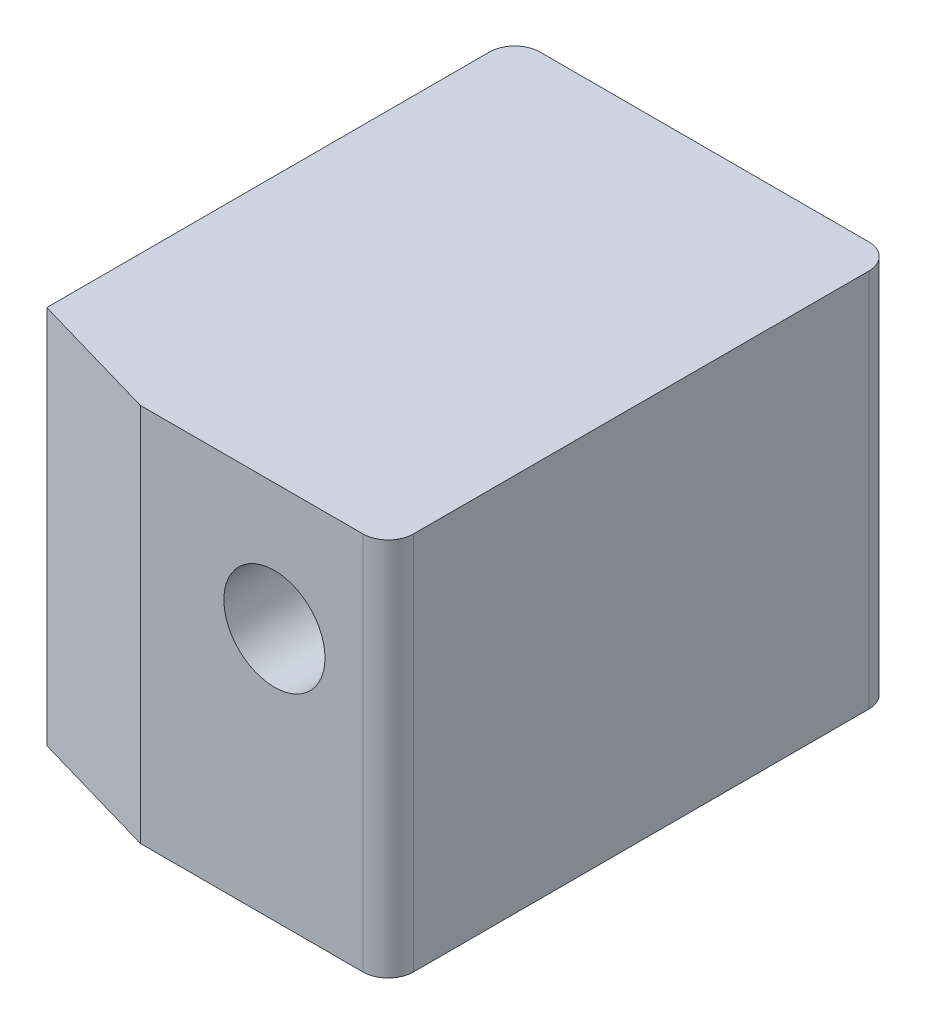
ISO-10303-21;
HEADER;
FILE_DESCRIPTION(('STEP AP214'),'2;1');
FILE_NAME('part.step','',(''),(''),'','','');
FILE_SCHEMA(('AUTOMOTIVE_DESIGN { 1 0 10303 214 1 1 1 1 }'));
ENDSEC;
DATA;
#1=APPLICATION_CONTEXT('core data for automotive mechanical design processes');
#2=APPLICATION_PROTOCOL_DEFINITION('international standard','automotive_design',2000,#1);
#3=PRODUCT_CONTEXT('',#1,'mechanical');
#4=PRODUCT('Part','Part','',(#3));
#5=PRODUCT_RELATED_PRODUCT_CATEGORY('part','',(#4));
#6=PRODUCT_DEFINITION_FORMATION('','',#4);
#7=PRODUCT_DEFINITION_CONTEXT('part definition',#1,'design');
#8=PRODUCT_DEFINITION('design','',#6,#7);
#9=PRODUCT_DEFINITION_SHAPE('','',#8);
#10=(LENGTH_UNIT() NAMED_UNIT(*) SI_UNIT(.MILLI.,.METRE.));
#11=(NAMED_UNIT(*) PLANE_ANGLE_UNIT() SI_UNIT($,.RADIAN.));
#12=(NAMED_UNIT(*) SI_UNIT($,.STERADIAN.) SOLID_ANGLE_UNIT());
#13=UNCERTAINTY_MEASURE_WITH_UNIT(LENGTH_MEASURE(1.E-05),#10,'distance_accuracy_value','');
#14=(GEOMETRIC_REPRESENTATION_CONTEXT(3) GLOBAL_UNCERTAINTY_ASSIGNED_CONTEXT((#13)) GLOBAL_UNIT_ASSIGNED_CONTEXT((#10,
#11,#12)) REPRESENTATION_CONTEXT('',''));
#15=CARTESIAN_POINT('',(0.,0.,0.));
#16=DIRECTION('',(0.,0.,1.));
#17=DIRECTION('',(1.,0.,0.));
#18=AXIS2_PLACEMENT_3D('',#15,#16,#17);
#19=CARTESIAN_POINT('',(0.,15.,0.));
#20=DIRECTION('',(0.,0.,-1.));
#21=DIRECTION('',(-1.,0.,0.));
#22=AXIS2_PLACEMENT_3D('',#19,#20,#21);
#23=PLANE('',#22);
#24=CARTESIAN_POINT('',(3.,10.,0.));
#25=DIRECTION('',(0.,0.,1.));
#26=DIRECTION('',(1.,0.,0.));
#27=AXIS2_PLACEMENT_3D('',#24,#25,#26);
#28=CIRCLE('',#27,2.);
#29=CARTESIAN_POINT('',(5.,10.,0.));
#30=VERTEX_POINT('',#29);
#31=EDGE_CURVE('E173',#30,#30,#28,.T.);
#32=ORIENTED_EDGE('',*,*,#31,.F.);
#33=EDGE_LOOP('',(#32));
#34=FACE_BOUND('',#33,.T.);
#35=DIRECTION('',(1.,0.,0.));
#36=VECTOR('',#35,1.);
#37=CARTESIAN_POINT('',(0.,15.,0.));
#38=LINE('',#37,#36);
#39=CARTESIAN_POINT('',(-2.3,15.,0.));
#40=VERTEX_POINT('',#39);
#41=CARTESIAN_POINT('',(6.5,15.,0.));
#42=VERTEX_POINT('',#41);
#43=EDGE_CURVE('E112',#40,#42,#38,.T.);
#44=ORIENTED_EDGE('',*,*,#43,.F.);
#45=DIRECTION('',(0.,1.,0.));
#46=VECTOR('',#45,1.);
#47=CARTESIAN_POINT('',(-2.3,-0.000999999999999265,0.));
#48=LINE('',#47,#46);
#49=CARTESIAN_POINT('',(-2.3,0.,0.));
#50=VERTEX_POINT('',#49);
#51=EDGE_CURVE('E102',#50,#40,#48,.T.);
#52=ORIENTED_EDGE('',*,*,#51,.F.);
#53=DIRECTION('',(1.,0.,0.));
#54=VECTOR('',#53,1.);
#55=CARTESIAN_POINT('',(0.,0.,0.));
#56=LINE('',#55,#54);
#57=CARTESIAN_POINT('',(6.5,0.,0.));
#58=VERTEX_POINT('',#57);
#59=EDGE_CURVE('E133',#50,#58,#56,.T.);
#60=ORIENTED_EDGE('',*,*,#59,.T.);
#61=DIRECTION('',(0.,-1.,0.));
#62=VECTOR('',#61,1.);
#63=CARTESIAN_POINT('',(6.5,15.,0.));
#64=LINE('',#63,#62);
#65=EDGE_CURVE('E11',#58,#42,#64,.F.);
#66=ORIENTED_EDGE('',*,*,#65,.T.);
#67=EDGE_LOOP('',(#44,#52,#60,#66));
#68=FACE_BOUND('',#67,.T.);
#69=ADVANCED_FACE('F37',(#34,#68),#23,.F.);
#70=CARTESIAN_POINT('',(7.5,15.,-20.));
#71=DIRECTION('',(-1.,0.,0.));
#72=DIRECTION('',(0.,0.,1.));
#73=AXIS2_PLACEMENT_3D('',#70,#71,#72);
#74=PLANE('',#73);
#75=DIRECTION('',(0.,0.,-1.));
#76=VECTOR('',#75,1.);
#77=CARTESIAN_POINT('',(7.5,0.,-20.));
#78=LINE('',#77,#76);
#79=CARTESIAN_POINT('',(7.5,0.,-1.));
#80=VERTEX_POINT('',#79);
#81=CARTESIAN_POINT('',(7.5,0.,-19.));
#82=VERTEX_POINT('',#81);
#83=EDGE_CURVE('E135',#80,#82,#78,.T.);
#84=ORIENTED_EDGE('',*,*,#83,.T.);
#85=DIRECTION('',(0.,-1.,0.));
#86=VECTOR('',#85,1.);
#87=CARTESIAN_POINT('',(7.5,15.,-19.));
#88=LINE('',#87,#86);
#89=CARTESIAN_POINT('',(7.5,15.,-19.));
#90=VERTEX_POINT('',#89);
#91=EDGE_CURVE('E155',#82,#90,#88,.F.);
#92=ORIENTED_EDGE('',*,*,#91,.T.);
#93=DIRECTION('',(0.,0.,-1.));
#94=VECTOR('',#93,1.);
#95=CARTESIAN_POINT('',(7.5,15.,-20.));
#96=LINE('',#95,#94);
#97=CARTESIAN_POINT('',(7.5,15.,-1.));
#98=VERTEX_POINT('',#97);
#99=EDGE_CURVE('E117',#98,#90,#96,.T.);
#100=ORIENTED_EDGE('',*,*,#99,.F.);
#101=DIRECTION('',(0.,-1.,0.));
#102=VECTOR('',#101,1.);
#103=CARTESIAN_POINT('',(7.5,15.,-1.));
#104=LINE('',#103,#102);
#105=EDGE_CURVE('E152',#98,#80,#104,.T.);
#106=ORIENTED_EDGE('',*,*,#105,.T.);
#107=EDGE_LOOP('',(#84,#92,#100,#106));
#108=FACE_BOUND('',#107,.T.);
#109=ADVANCED_FACE('F205',(#108),#74,.F.);
#110=CARTESIAN_POINT('',(-7.5,15.,-20.));
#111=DIRECTION('',(0.,0.,1.));
#112=DIRECTION('',(1.,0.,0.));
#113=AXIS2_PLACEMENT_3D('',#110,#111,#112);
#114=PLANE('',#113);
#115=DIRECTION('',(-1.,0.,0.));
#116=VECTOR('',#115,1.);
#117=CARTESIAN_POINT('',(-7.5,15.,-20.));
#118=LINE('',#117,#116);
#119=CARTESIAN_POINT('',(6.5,15.,-20.));
#120=VERTEX_POINT('',#119);
#121=CARTESIAN_POINT('',(-6.5,15.,-20.));
#122=VERTEX_POINT('',#121);
#123=EDGE_CURVE('E121',#120,#122,#118,.T.);
#124=ORIENTED_EDGE('',*,*,#123,.F.);
#125=DIRECTION('',(0.,-1.,0.));
#126=VECTOR('',#125,1.);
#127=CARTESIAN_POINT('',(6.5,15.,-20.));
#128=LINE('',#127,#126);
#129=CARTESIAN_POINT('',(6.5,0.,-20.));
#130=VERTEX_POINT('',#129);
#131=EDGE_CURVE('E142',#120,#130,#128,.T.);
#132=ORIENTED_EDGE('',*,*,#131,.T.);
#133=DIRECTION('',(-1.,0.,0.));
#134=VECTOR('',#133,1.);
#135=CARTESIAN_POINT('',(-7.5,0.,-20.));
#136=LINE('',#135,#134);
#137=CARTESIAN_POINT('',(-6.5,0.,-20.));
#138=VERTEX_POINT('',#137);
#139=EDGE_CURVE('E124',#130,#138,#136,.T.);
#140=ORIENTED_EDGE('',*,*,#139,.T.);
#141=DIRECTION('',(0.,-1.,0.));
#142=VECTOR('',#141,1.);
#143=CARTESIAN_POINT('',(-6.5,15.,-20.));
#144=LINE('',#143,#142);
#145=EDGE_CURVE('E132',#138,#122,#144,.F.);
#146=ORIENTED_EDGE('',*,*,#145,.T.);
#147=EDGE_LOOP('',(#124,#132,#140,#146));
#148=FACE_BOUND('',#147,.T.);
#149=ADVANCED_FACE('F211',(#148),#114,.F.);
#150=CARTESIAN_POINT('',(-7.5,15.,0.));
#151=DIRECTION('',(1.,0.,0.));
#152=DIRECTION('',(0.,0.,-1.));
#153=AXIS2_PLACEMENT_3D('',#150,#151,#152);
#154=PLANE('',#153);
#155=DIRECTION('',(0.,0.,1.));
#156=VECTOR('',#155,1.);
#157=CARTESIAN_POINT('',(-7.5,0.,0.));
#158=LINE('',#157,#156);
#159=CARTESIAN_POINT('',(-7.5,0.,-19.));
#160=VERTEX_POINT('',#159);
#161=CARTESIAN_POINT('',(-7.5,0.,-1.5));
#162=VERTEX_POINT('',#161);
#163=EDGE_CURVE('E118',#160,#162,#158,.T.);
#164=ORIENTED_EDGE('',*,*,#163,.T.);
#165=DIRECTION('',(0.,1.,0.));
#166=VECTOR('',#165,1.);
#167=CARTESIAN_POINT('',(-7.5,-0.000999999999999265,-1.5));
#168=LINE('',#167,#166);
#169=CARTESIAN_POINT('',(-7.5,15.,-1.5));
#170=VERTEX_POINT('',#169);
#171=EDGE_CURVE('E52',#162,#170,#168,.T.);
#172=ORIENTED_EDGE('',*,*,#171,.T.);
#173=DIRECTION('',(0.,0.,1.));
#174=VECTOR('',#173,1.);
#175=CARTESIAN_POINT('',(-7.5,15.,0.));
#176=LINE('',#175,#174);
#177=CARTESIAN_POINT('',(-7.5,15.,-19.));
#178=VERTEX_POINT('',#177);
#179=EDGE_CURVE('E113',#178,#170,#176,.T.);
#180=ORIENTED_EDGE('',*,*,#179,.F.);
#181=DIRECTION('',(0.,-1.,0.));
#182=VECTOR('',#181,1.);
#183=CARTESIAN_POINT('',(-7.5,15.,-19.));
#184=LINE('',#183,#182);
#185=EDGE_CURVE('E45',#178,#160,#184,.T.);
#186=ORIENTED_EDGE('',*,*,#185,.T.);
#187=EDGE_LOOP('',(#164,#172,#180,#186));
#188=FACE_BOUND('',#187,.T.);
#189=ADVANCED_FACE('F165',(#188),#154,.F.);
#190=CARTESIAN_POINT('',(0.,15.,0.));
#191=DIRECTION('',(0.,-1.,0.));
#192=DIRECTION('',(0.,0.,-1.));
#193=AXIS2_PLACEMENT_3D('',#190,#191,#192);
#194=PLANE('',#193);
#195=ORIENTED_EDGE('',*,*,#179,.T.);
#196=DIRECTION('',(-0.960823591180895,0.,-0.277160651302181));
#197=VECTOR('',#196,1.);
#198=CARTESIAN_POINT('',(-7.5,15.,-1.5));
#199=LINE('',#198,#197);
#200=EDGE_CURVE('E105',#40,#170,#199,.T.);
#201=ORIENTED_EDGE('',*,*,#200,.F.);
#202=ORIENTED_EDGE('',*,*,#43,.T.);
#203=CARTESIAN_POINT('',(6.5,15.,-1.));
#204=DIRECTION('',(0.,-1.,0.));
#205=DIRECTION('',(0.,0.,-1.));
#206=AXIS2_PLACEMENT_3D('',#203,#204,#205);
#207=CIRCLE('',#206,1.);
#208=EDGE_CURVE('E157',#42,#98,#207,.F.);
#209=ORIENTED_EDGE('',*,*,#208,.T.);
#210=ORIENTED_EDGE('',*,*,#99,.T.);
#211=CARTESIAN_POINT('',(6.5,15.,-19.));
#212=DIRECTION('',(0.,-1.,0.));
#213=DIRECTION('',(0.,0.,-1.));
#214=AXIS2_PLACEMENT_3D('',#211,#212,#213);
#215=CIRCLE('',#214,1.);
#216=EDGE_CURVE('E160',#90,#120,#215,.F.);
#217=ORIENTED_EDGE('',*,*,#216,.T.);
#218=ORIENTED_EDGE('',*,*,#123,.T.);
#219=CARTESIAN_POINT('',(-6.5,15.,-19.));
#220=DIRECTION('',(0.,-1.,0.));
#221=DIRECTION('',(0.,0.,-1.));
#222=AXIS2_PLACEMENT_3D('',#219,#220,#221);
#223=CIRCLE('',#222,1.);
#224=EDGE_CURVE('E60',#122,#178,#223,.F.);
#225=ORIENTED_EDGE('',*,*,#224,.T.);
#226=EDGE_LOOP('',(#195,#201,#202,#209,#210,#217,#218,#225));
#227=FACE_BOUND('',#226,.T.);
#228=ADVANCED_FACE('F111',(#227),#194,.F.);
#229=CARTESIAN_POINT('',(0.,0.,0.));
#230=DIRECTION('',(0.,-1.,0.));
#231=DIRECTION('',(0.,0.,-1.));
#232=AXIS2_PLACEMENT_3D('',#229,#230,#231);
#233=PLANE('',#232);
#234=DIRECTION('',(-0.960823591180895,0.,-0.277160651302181));
#235=VECTOR('',#234,1.);
#236=CARTESIAN_POINT('',(-7.5,0.,-1.5));
#237=LINE('',#236,#235);
#238=EDGE_CURVE('E106',#50,#162,#237,.T.);
#239=ORIENTED_EDGE('',*,*,#238,.T.);
#240=ORIENTED_EDGE('',*,*,#163,.F.);
#241=CARTESIAN_POINT('',(-6.5,0.,-19.));
#242=DIRECTION('',(0.,-1.,0.));
#243=DIRECTION('',(0.,0.,-1.));
#244=AXIS2_PLACEMENT_3D('',#241,#242,#243);
#245=CIRCLE('',#244,1.);
#246=EDGE_CURVE('E148',#160,#138,#245,.T.);
#247=ORIENTED_EDGE('',*,*,#246,.T.);
#248=ORIENTED_EDGE('',*,*,#139,.F.);
#249=CARTESIAN_POINT('',(6.5,0.,-19.));
#250=DIRECTION('',(0.,-1.,0.));
#251=DIRECTION('',(0.,0.,-1.));
#252=AXIS2_PLACEMENT_3D('',#249,#250,#251);
#253=CIRCLE('',#252,1.);
#254=EDGE_CURVE('E150',#130,#82,#253,.T.);
#255=ORIENTED_EDGE('',*,*,#254,.T.);
#256=ORIENTED_EDGE('',*,*,#83,.F.);
#257=CARTESIAN_POINT('',(6.5,0.,-1.));
#258=DIRECTION('',(0.,-1.,0.));
#259=DIRECTION('',(0.,0.,-1.));
#260=AXIS2_PLACEMENT_3D('',#257,#258,#259);
#261=CIRCLE('',#260,1.);
#262=EDGE_CURVE('E145',#80,#58,#261,.T.);
#263=ORIENTED_EDGE('',*,*,#262,.T.);
#264=ORIENTED_EDGE('',*,*,#59,.F.);
#265=EDGE_LOOP('',(#239,#240,#247,#248,#255,#256,#263,#264));
#266=FACE_BOUND('',#265,.T.);
#267=CARTESIAN_POINT('',(3.,0.,-16.));
#268=DIRECTION('',(0.,-1.,0.));
#269=DIRECTION('',(0.,0.,-1.));
#270=AXIS2_PLACEMENT_3D('',#267,#268,#269);
#271=CIRCLE('',#270,2.);
#272=CARTESIAN_POINT('',(3.,0.,-18.));
#273=VERTEX_POINT('',#272);
#274=EDGE_CURVE('E182',#273,#273,#271,.T.);
#275=ORIENTED_EDGE('',*,*,#274,.F.);
#276=EDGE_LOOP('',(#275));
#277=FACE_BOUND('',#276,.T.);
#278=CARTESIAN_POINT('',(-3.,0.,-4.));
#279=DIRECTION('',(0.,-1.,0.));
#280=DIRECTION('',(0.,0.,-1.));
#281=AXIS2_PLACEMENT_3D('',#278,#279,#280);
#282=CIRCLE('',#281,2.);
#283=CARTESIAN_POINT('',(-3.,0.,-6.));
#284=VERTEX_POINT('',#283);
#285=EDGE_CURVE('E127',#284,#284,#282,.T.);
#286=ORIENTED_EDGE('',*,*,#285,.F.);
#287=EDGE_LOOP('',(#286));
#288=FACE_BOUND('',#287,.T.);
#289=ADVANCED_FACE('F168',(#266,#277,#288),#233,.T.);
#290=CARTESIAN_POINT('',(-3.,12.,-4.));
#291=DIRECTION('',(0.,-1.,0.));
#292=DIRECTION('',(0.,0.,-1.));
#293=AXIS2_PLACEMENT_3D('',#290,#291,#292);
#294=CYLINDRICAL_SURFACE('',#293,2.);
#295=CARTESIAN_POINT('',(-3.,12.,-4.));
#296=DIRECTION('',(0.,-1.,0.));
#297=DIRECTION('',(0.,0.,-1.));
#298=AXIS2_PLACEMENT_3D('',#295,#296,#297);
#299=CIRCLE('',#298,2.);
#300=CARTESIAN_POINT('',(-3.,12.,-6.));
#301=VERTEX_POINT('',#300);
#302=EDGE_CURVE('E184',#301,#301,#299,.T.);
#303=ORIENTED_EDGE('',*,*,#302,.F.);
#304=EDGE_LOOP('',(#303));
#305=FACE_BOUND('',#304,.T.);
#306=ORIENTED_EDGE('',*,*,#285,.T.);
#307=EDGE_LOOP('',(#306));
#308=FACE_BOUND('',#307,.T.);
#309=ADVANCED_FACE('F191',(#305,#308),#294,.F.);
#310=CARTESIAN_POINT('',(-3.,12.,-4.));
#311=DIRECTION('',(0.,-1.,0.));
#312=DIRECTION('',(0.,0.,-1.));
#313=AXIS2_PLACEMENT_3D('',#310,#311,#312);
#314=PLANE('',#313);
#315=ORIENTED_EDGE('',*,*,#302,.T.);
#316=EDGE_LOOP('',(#315));
#317=FACE_BOUND('',#316,.T.);
#318=ADVANCED_FACE('F199',(#317),#314,.T.);
#319=CARTESIAN_POINT('',(3.,12.,-16.));
#320=DIRECTION('',(0.,-1.,0.));
#321=DIRECTION('',(0.,0.,-1.));
#322=AXIS2_PLACEMENT_3D('',#319,#320,#321);
#323=CYLINDRICAL_SURFACE('',#322,2.);
#324=CARTESIAN_POINT('',(3.,12.,-16.));
#325=DIRECTION('',(0.,-1.,0.));
#326=DIRECTION('',(0.,0.,-1.));
#327=AXIS2_PLACEMENT_3D('',#324,#325,#326);
#328=CIRCLE('',#327,2.);
#329=CARTESIAN_POINT('',(3.,12.,-18.));
#330=VERTEX_POINT('',#329);
#331=EDGE_CURVE('E136',#330,#330,#328,.T.);
#332=ORIENTED_EDGE('',*,*,#331,.F.);
#333=EDGE_LOOP('',(#332));
#334=FACE_BOUND('',#333,.T.);
#335=ORIENTED_EDGE('',*,*,#274,.T.);
#336=EDGE_LOOP('',(#335));
#337=FACE_BOUND('',#336,.T.);
#338=ADVANCED_FACE('F315',(#334,#337),#323,.F.);
#339=CARTESIAN_POINT('',(3.,12.,-16.));
#340=DIRECTION('',(0.,-1.,0.));
#341=DIRECTION('',(0.,0.,-1.));
#342=AXIS2_PLACEMENT_3D('',#339,#340,#341);
#343=PLANE('',#342);
#344=ORIENTED_EDGE('',*,*,#331,.T.);
#345=EDGE_LOOP('',(#344));
#346=FACE_BOUND('',#345,.T.);
#347=ADVANCED_FACE('F307',(#346),#343,.T.);
#348=CARTESIAN_POINT('',(3.,10.,-12.));
#349=DIRECTION('',(0.,0.,1.));
#350=DIRECTION('',(1.,0.,0.));
#351=AXIS2_PLACEMENT_3D('',#348,#349,#350);
#352=CYLINDRICAL_SURFACE('',#351,2.);
#353=CARTESIAN_POINT('',(3.,10.,-12.));
#354=DIRECTION('',(0.,0.,1.));
#355=DIRECTION('',(1.,0.,0.));
#356=AXIS2_PLACEMENT_3D('',#353,#354,#355);
#357=CIRCLE('',#356,2.);
#358=CARTESIAN_POINT('',(5.,10.,-12.));
#359=VERTEX_POINT('',#358);
#360=EDGE_CURVE('E175',#359,#359,#357,.T.);
#361=ORIENTED_EDGE('',*,*,#360,.F.);
#362=EDGE_LOOP('',(#361));
#363=FACE_BOUND('',#362,.T.);
#364=ORIENTED_EDGE('',*,*,#31,.T.);
#365=EDGE_LOOP('',(#364));
#366=FACE_BOUND('',#365,.T.);
#367=ADVANCED_FACE('F300',(#363,#366),#352,.F.);
#368=CARTESIAN_POINT('',(3.,10.,-12.));
#369=DIRECTION('',(0.,0.,1.));
#370=DIRECTION('',(1.,0.,0.));
#371=AXIS2_PLACEMENT_3D('',#368,#369,#370);
#372=PLANE('',#371);
#373=ORIENTED_EDGE('',*,*,#360,.T.);
#374=EDGE_LOOP('',(#373));
#375=FACE_BOUND('',#374,.T.);
#376=ADVANCED_FACE('F220',(#375),#372,.T.);
#377=CARTESIAN_POINT('',(6.5,15.,-19.));
#378=DIRECTION('',(0.,-1.,0.));
#379=DIRECTION('',(0.,0.,-1.));
#380=AXIS2_PLACEMENT_3D('',#377,#378,#379);
#381=CYLINDRICAL_SURFACE('',#380,1.);
#382=ORIENTED_EDGE('',*,*,#216,.F.);
#383=ORIENTED_EDGE('',*,*,#91,.F.);
#384=ORIENTED_EDGE('',*,*,#254,.F.);
#385=ORIENTED_EDGE('',*,*,#131,.F.);
#386=EDGE_LOOP('',(#382,#383,#384,#385));
#387=FACE_BOUND('',#386,.T.);
#388=ADVANCED_FACE('F217',(#387),#381,.T.);
#389=CARTESIAN_POINT('',(-6.5,15.,-19.));
#390=DIRECTION('',(0.,-1.,0.));
#391=DIRECTION('',(0.,0.,-1.));
#392=AXIS2_PLACEMENT_3D('',#389,#390,#391);
#393=CYLINDRICAL_SURFACE('',#392,1.);
#394=ORIENTED_EDGE('',*,*,#224,.F.);
#395=ORIENTED_EDGE('',*,*,#145,.F.);
#396=ORIENTED_EDGE('',*,*,#246,.F.);
#397=ORIENTED_EDGE('',*,*,#185,.F.);
#398=EDGE_LOOP('',(#394,#395,#396,#397));
#399=FACE_BOUND('',#398,.T.);
#400=ADVANCED_FACE('F219',(#399),#393,.T.);
#401=CARTESIAN_POINT('',(6.5,15.,-1.));
#402=DIRECTION('',(0.,-1.,0.));
#403=DIRECTION('',(0.,0.,-1.));
#404=AXIS2_PLACEMENT_3D('',#401,#402,#403);
#405=CYLINDRICAL_SURFACE('',#404,1.);
#406=ORIENTED_EDGE('',*,*,#208,.F.);
#407=ORIENTED_EDGE('',*,*,#65,.F.);
#408=ORIENTED_EDGE('',*,*,#262,.F.);
#409=ORIENTED_EDGE('',*,*,#105,.F.);
#410=EDGE_LOOP('',(#406,#407,#408,#409));
#411=FACE_BOUND('',#410,.T.);
#412=ADVANCED_FACE('F39',(#411),#405,.T.);
#413=CARTESIAN_POINT('',(-7.5,-0.000999999999999265,-1.5));
#414=DIRECTION('',(0.277160651302181,0.,-0.960823591180894));
#415=DIRECTION('',(-0.960823591180895,0.,-0.277160651302181));
#416=AXIS2_PLACEMENT_3D('',#413,#414,#415);
#417=PLANE('',#416);
#418=ORIENTED_EDGE('',*,*,#51,.T.);
#419=ORIENTED_EDGE('',*,*,#200,.T.);
#420=ORIENTED_EDGE('',*,*,#171,.F.);
#421=ORIENTED_EDGE('',*,*,#238,.F.);
#422=EDGE_LOOP('',(#418,#419,#420,#421));
#423=FACE_BOUND('',#422,.T.);
#424=ADVANCED_FACE('F104',(#423),#417,.F.);
#425=CLOSED_SHELL('',(#69,#109,#149,#189,#228,#289,#309,#318,#338,#347,#367,#376,#388,#400,#412,#424));
#426=MANIFOLD_SOLID_BREP('B2',#425);
#427=ADVANCED_BREP_SHAPE_REPRESENTATION('',(#18,#426),#14);
#428=SHAPE_DEFINITION_REPRESENTATION(#9,#427);
ENDSEC;
END-ISO-10303-21;
